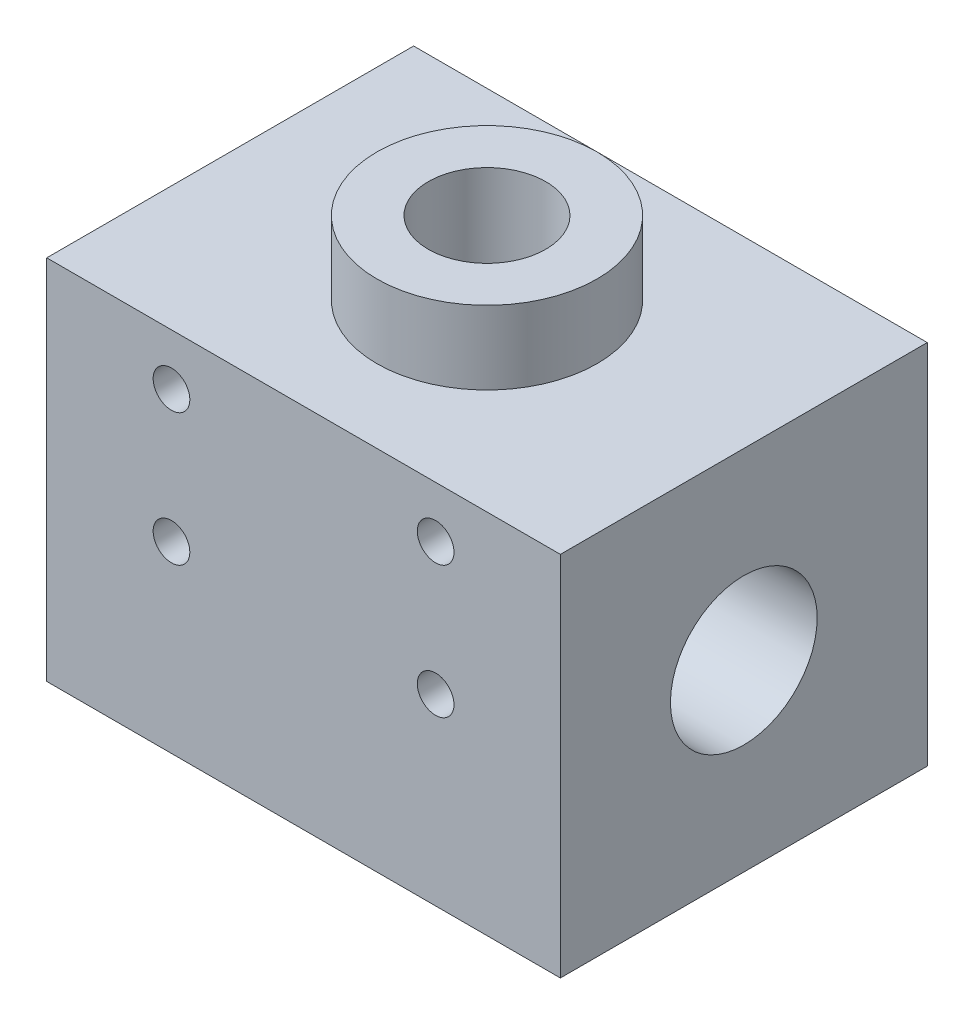
ISO-10303-21;
HEADER;
FILE_DESCRIPTION(('STEP AP214'),'2;1');
FILE_NAME('part.step','',(''),(''),'','','');
FILE_SCHEMA(('AUTOMOTIVE_DESIGN { 1 0 10303 214 1 1 1 1 }'));
ENDSEC;
DATA;
#1=APPLICATION_CONTEXT('core data for automotive mechanical design processes');
#2=APPLICATION_PROTOCOL_DEFINITION('international standard','automotive_design',2000,#1);
#3=PRODUCT_CONTEXT('',#1,'mechanical');
#4=PRODUCT('Part','Part','',(#3));
#5=PRODUCT_RELATED_PRODUCT_CATEGORY('part','',(#4));
#6=PRODUCT_DEFINITION_FORMATION('','',#4);
#7=PRODUCT_DEFINITION_CONTEXT('part definition',#1,'design');
#8=PRODUCT_DEFINITION('design','',#6,#7);
#9=PRODUCT_DEFINITION_SHAPE('','',#8);
#10=(LENGTH_UNIT() NAMED_UNIT(*) SI_UNIT(.MILLI.,.METRE.));
#11=(NAMED_UNIT(*) PLANE_ANGLE_UNIT() SI_UNIT($,.RADIAN.));
#12=(NAMED_UNIT(*) SI_UNIT($,.STERADIAN.) SOLID_ANGLE_UNIT());
#13=UNCERTAINTY_MEASURE_WITH_UNIT(LENGTH_MEASURE(1.E-05),#10,'distance_accuracy_value','');
#14=(GEOMETRIC_REPRESENTATION_CONTEXT(3) GLOBAL_UNCERTAINTY_ASSIGNED_CONTEXT((#13)) GLOBAL_UNIT_ASSIGNED_CONTEXT((#10,
#11,#12)) REPRESENTATION_CONTEXT('',''));
#15=CARTESIAN_POINT('',(0.,0.,0.));
#16=DIRECTION('',(0.,0.,1.));
#17=DIRECTION('',(1.,0.,0.));
#18=AXIS2_PLACEMENT_3D('',#15,#16,#17);
#19=CARTESIAN_POINT('',(-35.,50.,25.));
#20=DIRECTION('',(1.,0.,0.));
#21=DIRECTION('',(0.,0.,-1.));
#22=AXIS2_PLACEMENT_3D('',#19,#20,#21);
#23=PLANE('',#22);
#24=CARTESIAN_POINT('',(-35.,25.,0.));
#25=DIRECTION('',(1.,0.,0.));
#26=DIRECTION('',(0.,0.,-1.));
#27=AXIS2_PLACEMENT_3D('',#24,#25,#26);
#28=CIRCLE('',#27,10.);
#29=CARTESIAN_POINT('',(-35.,25.,-10.));
#30=VERTEX_POINT('',#29);
#31=EDGE_CURVE('E149',#30,#30,#28,.T.);
#32=ORIENTED_EDGE('',*,*,#31,.T.);
#33=EDGE_LOOP('',(#32));
#34=FACE_BOUND('',#33,.T.);
#35=DIRECTION('',(0.,0.,1.));
#36=VECTOR('',#35,1.);
#37=CARTESIAN_POINT('',(-35.,0.,25.));
#38=LINE('',#37,#36);
#39=CARTESIAN_POINT('',(-35.,0.,-25.));
#40=VERTEX_POINT('',#39);
#41=CARTESIAN_POINT('',(-35.,0.,25.));
#42=VERTEX_POINT('',#41);
#43=EDGE_CURVE('E130',#40,#42,#38,.T.);
#44=ORIENTED_EDGE('',*,*,#43,.T.);
#45=DIRECTION('',(0.,-1.,0.));
#46=VECTOR('',#45,1.);
#47=CARTESIAN_POINT('',(-35.,50.,25.));
#48=LINE('',#47,#46);
#49=CARTESIAN_POINT('',(-35.,50.,25.));
#50=VERTEX_POINT('',#49);
#51=EDGE_CURVE('E66',#50,#42,#48,.T.);
#52=ORIENTED_EDGE('',*,*,#51,.F.);
#53=DIRECTION('',(0.,0.,1.));
#54=VECTOR('',#53,1.);
#55=CARTESIAN_POINT('',(-35.,50.,25.));
#56=LINE('',#55,#54);
#57=CARTESIAN_POINT('',(-35.,50.,-25.));
#58=VERTEX_POINT('',#57);
#59=EDGE_CURVE('E111',#58,#50,#56,.T.);
#60=ORIENTED_EDGE('',*,*,#59,.F.);
#61=DIRECTION('',(0.,-1.,0.));
#62=VECTOR('',#61,1.);
#63=CARTESIAN_POINT('',(-35.,50.,-25.));
#64=LINE('',#63,#62);
#65=EDGE_CURVE('E126',#58,#40,#64,.T.);
#66=ORIENTED_EDGE('',*,*,#65,.T.);
#67=EDGE_LOOP('',(#44,#52,#60,#66));
#68=FACE_BOUND('',#67,.T.);
#69=ADVANCED_FACE('F51',(#34,#68),#23,.F.);
#70=CARTESIAN_POINT('',(35.,50.,25.));
#71=DIRECTION('',(0.,0.,-1.));
#72=DIRECTION('',(-1.,0.,0.));
#73=AXIS2_PLACEMENT_3D('',#70,#71,#72);
#74=PLANE('',#73);
#75=CARTESIAN_POINT('',(18.,25.,25.));
#76=DIRECTION('',(0.,0.,1.));
#77=DIRECTION('',(1.,0.,0.));
#78=AXIS2_PLACEMENT_3D('',#75,#76,#77);
#79=CIRCLE('',#78,2.5);
#80=CARTESIAN_POINT('',(20.5,25.,25.));
#81=VERTEX_POINT('',#80);
#82=EDGE_CURVE('E179',#81,#81,#79,.T.);
#83=ORIENTED_EDGE('',*,*,#82,.F.);
#84=EDGE_LOOP('',(#83));
#85=FACE_BOUND('',#84,.T.);
#86=CARTESIAN_POINT('',(-18.,43.,25.));
#87=DIRECTION('',(0.,0.,1.));
#88=DIRECTION('',(1.,0.,0.));
#89=AXIS2_PLACEMENT_3D('',#86,#87,#88);
#90=CIRCLE('',#89,2.5);
#91=CARTESIAN_POINT('',(-15.5,43.,25.));
#92=VERTEX_POINT('',#91);
#93=EDGE_CURVE('E196',#92,#92,#90,.T.);
#94=ORIENTED_EDGE('',*,*,#93,.F.);
#95=EDGE_LOOP('',(#94));
#96=FACE_BOUND('',#95,.T.);
#97=CARTESIAN_POINT('',(18.,43.,25.));
#98=DIRECTION('',(0.,0.,1.));
#99=DIRECTION('',(1.,0.,0.));
#100=AXIS2_PLACEMENT_3D('',#97,#98,#99);
#101=CIRCLE('',#100,2.5);
#102=CARTESIAN_POINT('',(20.5,43.,25.));
#103=VERTEX_POINT('',#102);
#104=EDGE_CURVE('E185',#103,#103,#101,.T.);
#105=ORIENTED_EDGE('',*,*,#104,.F.);
#106=EDGE_LOOP('',(#105));
#107=FACE_BOUND('',#106,.T.);
#108=CARTESIAN_POINT('',(-18.,25.,25.));
#109=DIRECTION('',(0.,0.,1.));
#110=DIRECTION('',(1.,0.,0.));
#111=AXIS2_PLACEMENT_3D('',#108,#109,#110);
#112=CIRCLE('',#111,2.5);
#113=CARTESIAN_POINT('',(-15.5,25.,25.));
#114=VERTEX_POINT('',#113);
#115=EDGE_CURVE('E171',#114,#114,#112,.T.);
#116=ORIENTED_EDGE('',*,*,#115,.F.);
#117=EDGE_LOOP('',(#116));
#118=FACE_BOUND('',#117,.T.);
#119=DIRECTION('',(1.,0.,0.));
#120=VECTOR('',#119,1.);
#121=CARTESIAN_POINT('',(35.,0.,25.));
#122=LINE('',#121,#120);
#123=CARTESIAN_POINT('',(35.,0.,25.));
#124=VERTEX_POINT('',#123);
#125=EDGE_CURVE('E117',#42,#124,#122,.T.);
#126=ORIENTED_EDGE('',*,*,#125,.T.);
#127=DIRECTION('',(0.,-1.,0.));
#128=VECTOR('',#127,1.);
#129=CARTESIAN_POINT('',(35.,50.,25.));
#130=LINE('',#129,#128);
#131=CARTESIAN_POINT('',(35.,50.,25.));
#132=VERTEX_POINT('',#131);
#133=EDGE_CURVE('E115',#132,#124,#130,.T.);
#134=ORIENTED_EDGE('',*,*,#133,.F.);
#135=DIRECTION('',(1.,0.,0.));
#136=VECTOR('',#135,1.);
#137=CARTESIAN_POINT('',(35.,50.,25.));
#138=LINE('',#137,#136);
#139=EDGE_CURVE('E106',#50,#132,#138,.T.);
#140=ORIENTED_EDGE('',*,*,#139,.F.);
#141=ORIENTED_EDGE('',*,*,#51,.T.);
#142=EDGE_LOOP('',(#126,#134,#140,#141));
#143=FACE_BOUND('',#142,.T.);
#144=ADVANCED_FACE('F116',(#85,#96,#107,#118,#143),#74,.F.);
#145=CARTESIAN_POINT('',(35.,50.,-25.));
#146=DIRECTION('',(-1.,0.,0.));
#147=DIRECTION('',(0.,0.,1.));
#148=AXIS2_PLACEMENT_3D('',#145,#146,#147);
#149=PLANE('',#148);
#150=CARTESIAN_POINT('',(35.,25.,0.));
#151=DIRECTION('',(-1.,0.,0.));
#152=DIRECTION('',(0.,0.,1.));
#153=AXIS2_PLACEMENT_3D('',#150,#151,#152);
#154=CIRCLE('',#153,10.);
#155=CARTESIAN_POINT('',(35.,25.,10.));
#156=VERTEX_POINT('',#155);
#157=EDGE_CURVE('E146',#156,#156,#154,.T.);
#158=ORIENTED_EDGE('',*,*,#157,.T.);
#159=EDGE_LOOP('',(#158));
#160=FACE_BOUND('',#159,.T.);
#161=DIRECTION('',(0.,0.,-1.));
#162=VECTOR('',#161,1.);
#163=CARTESIAN_POINT('',(35.,0.,-25.));
#164=LINE('',#163,#162);
#165=CARTESIAN_POINT('',(35.,0.,-25.));
#166=VERTEX_POINT('',#165);
#167=EDGE_CURVE('E92',#124,#166,#164,.T.);
#168=ORIENTED_EDGE('',*,*,#167,.T.);
#169=DIRECTION('',(0.,-1.,0.));
#170=VECTOR('',#169,1.);
#171=CARTESIAN_POINT('',(35.,50.,-25.));
#172=LINE('',#171,#170);
#173=CARTESIAN_POINT('',(35.,50.,-25.));
#174=VERTEX_POINT('',#173);
#175=EDGE_CURVE('E119',#174,#166,#172,.T.);
#176=ORIENTED_EDGE('',*,*,#175,.F.);
#177=DIRECTION('',(0.,0.,-1.));
#178=VECTOR('',#177,1.);
#179=CARTESIAN_POINT('',(35.,50.,-25.));
#180=LINE('',#179,#178);
#181=EDGE_CURVE('E109',#132,#174,#180,.T.);
#182=ORIENTED_EDGE('',*,*,#181,.F.);
#183=ORIENTED_EDGE('',*,*,#133,.T.);
#184=EDGE_LOOP('',(#168,#176,#182,#183));
#185=FACE_BOUND('',#184,.T.);
#186=ADVANCED_FACE('F121',(#160,#185),#149,.F.);
#187=CARTESIAN_POINT('',(-35.,50.,-25.));
#188=DIRECTION('',(0.,0.,1.));
#189=DIRECTION('',(1.,0.,0.));
#190=AXIS2_PLACEMENT_3D('',#187,#188,#189);
#191=PLANE('',#190);
#192=DIRECTION('',(-1.,0.,0.));
#193=VECTOR('',#192,1.);
#194=CARTESIAN_POINT('',(-35.,0.,-25.));
#195=LINE('',#194,#193);
#196=EDGE_CURVE('E98',#166,#40,#195,.T.);
#197=ORIENTED_EDGE('',*,*,#196,.T.);
#198=ORIENTED_EDGE('',*,*,#65,.F.);
#199=DIRECTION('',(-1.,0.,0.));
#200=VECTOR('',#199,1.);
#201=CARTESIAN_POINT('',(-35.,50.,-25.));
#202=LINE('',#201,#200);
#203=EDGE_CURVE('E75',#174,#58,#202,.T.);
#204=ORIENTED_EDGE('',*,*,#203,.F.);
#205=ORIENTED_EDGE('',*,*,#175,.T.);
#206=EDGE_LOOP('',(#197,#198,#204,#205));
#207=FACE_BOUND('',#206,.T.);
#208=ADVANCED_FACE('F252',(#207),#191,.F.);
#209=CARTESIAN_POINT('',(0.,50.,0.));
#210=DIRECTION('',(0.,-1.,0.));
#211=DIRECTION('',(0.,0.,-1.));
#212=AXIS2_PLACEMENT_3D('',#209,#210,#211);
#213=PLANE('',#212);
#214=CARTESIAN_POINT('',(0.,50.,0.));
#215=DIRECTION('',(0.,1.,0.));
#216=DIRECTION('',(0.,0.,1.));
#217=AXIS2_PLACEMENT_3D('',#214,#215,#216);
#218=CIRCLE('',#217,15.);
#219=CARTESIAN_POINT('',(0.,50.,15.));
#220=VERTEX_POINT('',#219);
#221=EDGE_CURVE('E11',#220,#220,#218,.T.);
#222=ORIENTED_EDGE('',*,*,#221,.F.);
#223=EDGE_LOOP('',(#222));
#224=FACE_BOUND('',#223,.T.);
#225=ORIENTED_EDGE('',*,*,#59,.T.);
#226=ORIENTED_EDGE('',*,*,#139,.T.);
#227=ORIENTED_EDGE('',*,*,#181,.T.);
#228=ORIENTED_EDGE('',*,*,#203,.T.);
#229=EDGE_LOOP('',(#225,#226,#227,#228));
#230=FACE_BOUND('',#229,.T.);
#231=ADVANCED_FACE('F107',(#224,#230),#213,.F.);
#232=CARTESIAN_POINT('',(0.,0.,0.));
#233=DIRECTION('',(0.,-1.,0.));
#234=DIRECTION('',(0.,0.,-1.));
#235=AXIS2_PLACEMENT_3D('',#232,#233,#234);
#236=PLANE('',#235);
#237=ORIENTED_EDGE('',*,*,#43,.F.);
#238=ORIENTED_EDGE('',*,*,#196,.F.);
#239=ORIENTED_EDGE('',*,*,#167,.F.);
#240=ORIENTED_EDGE('',*,*,#125,.F.);
#241=EDGE_LOOP('',(#237,#238,#239,#240));
#242=FACE_BOUND('',#241,.T.);
#243=ADVANCED_FACE('F242',(#242),#236,.T.);
#244=CARTESIAN_POINT('',(0.,60.,0.));
#245=DIRECTION('',(0.,-1.,0.));
#246=DIRECTION('',(0.,0.,-1.));
#247=AXIS2_PLACEMENT_3D('',#244,#245,#246);
#248=CYLINDRICAL_SURFACE('',#247,15.);
#249=CARTESIAN_POINT('',(0.,60.,0.));
#250=DIRECTION('',(0.,1.,0.));
#251=DIRECTION('',(0.,0.,1.));
#252=AXIS2_PLACEMENT_3D('',#249,#250,#251);
#253=CIRCLE('',#252,15.);
#254=CARTESIAN_POINT('',(0.,60.,15.));
#255=VERTEX_POINT('',#254);
#256=EDGE_CURVE('E134',#255,#255,#253,.T.);
#257=ORIENTED_EDGE('',*,*,#256,.F.);
#258=EDGE_LOOP('',(#257));
#259=FACE_BOUND('',#258,.T.);
#260=ORIENTED_EDGE('',*,*,#221,.T.);
#261=EDGE_LOOP('',(#260));
#262=FACE_BOUND('',#261,.T.);
#263=ADVANCED_FACE('F244',(#259,#262),#248,.T.);
#264=CARTESIAN_POINT('',(0.,60.,0.));
#265=DIRECTION('',(0.,1.,0.));
#266=DIRECTION('',(0.,0.,1.));
#267=AXIS2_PLACEMENT_3D('',#264,#265,#266);
#268=PLANE('',#267);
#269=CARTESIAN_POINT('',(0.,60.,0.));
#270=DIRECTION('',(0.,1.,0.));
#271=DIRECTION('',(0.,0.,1.));
#272=AXIS2_PLACEMENT_3D('',#269,#270,#271);
#273=CIRCLE('',#272,8.);
#274=CARTESIAN_POINT('',(0.,60.,8.));
#275=VERTEX_POINT('',#274);
#276=EDGE_CURVE('E157',#275,#275,#273,.T.);
#277=ORIENTED_EDGE('',*,*,#276,.F.);
#278=EDGE_LOOP('',(#277));
#279=FACE_BOUND('',#278,.T.);
#280=ORIENTED_EDGE('',*,*,#256,.T.);
#281=EDGE_LOOP('',(#280));
#282=FACE_BOUND('',#281,.T.);
#283=ADVANCED_FACE('F249',(#279,#282),#268,.T.);
#284=CARTESIAN_POINT('',(-71.,25.,0.));
#285=DIRECTION('',(1.,0.,0.));
#286=DIRECTION('',(0.,0.,-1.));
#287=AXIS2_PLACEMENT_3D('',#284,#285,#286);
#288=CYLINDRICAL_SURFACE('',#287,10.);
#289=CARTESIAN_POINT('',(0.,31.,8.));
#290=CARTESIAN_POINT('',(0.15022459738487,31.0000035625211,7.99999850547057));
#291=CARTESIAN_POINT('',(0.300504131601658,31.0056701147003,7.99575712002106));
#292=CARTESIAN_POINT('',(0.599822762570285,31.028057010504,7.97889190649412));
#293=CARTESIAN_POINT('',(0.748860943249638,31.0447848916728,7.96626236243051));
#294=CARTESIAN_POINT('',(1.04487223919572,31.0885361116284,7.93287350748029));
#295=CARTESIAN_POINT('',(1.1918391486777,31.1155854892796,7.9120936313708));
#296=CARTESIAN_POINT('',(1.48254201812359,31.1788162695663,7.86281319571144));
#297=CARTESIAN_POINT('',(1.62627575657817,31.2150037541004,7.83430749328154));
#298=CARTESIAN_POINT('',(1.95928819427813,31.309133847231,7.75884142962143));
#299=CARTESIAN_POINT('',(2.14699454247974,31.3702638264302,7.70891139176625));
#300=CARTESIAN_POINT('',(2.51467773958042,31.5033987631141,7.59693100706947));
#301=CARTESIAN_POINT('',(2.6946543370537,31.5754040739974,7.53488026634113));
#302=CARTESIAN_POINT('',(3.04722385598971,31.7275717216712,7.39933665411533));
#303=CARTESIAN_POINT('',(3.21979742729863,31.8077537806487,7.32581587966415));
#304=CARTESIAN_POINT('',(3.55716094079825,31.9736527052382,7.16807370451545));
#305=CARTESIAN_POINT('',(3.72195108039004,32.059369430351,7.08385257539726));
#306=CARTESIAN_POINT('',(4.10215769308783,32.2659318278601,6.87278634555154));
#307=CARTESIAN_POINT('',(4.31433145410594,32.3882714394334,6.74154128211599));
#308=CARTESIAN_POINT('',(4.72473552644333,32.6352012594411,6.46055204176311));
#309=CARTESIAN_POINT('',(4.92296079286415,32.7597922618913,6.31080122510044));
#310=CARTESIAN_POINT('',(5.30497690322165,33.0076016087498,5.99323431368263));
#311=CARTESIAN_POINT('',(5.48877921215059,33.1308209752286,5.82543282445919));
#312=CARTESIAN_POINT('',(5.84132029595654,33.3728499756174,5.47186088496404));
#313=CARTESIAN_POINT('',(6.01006407939447,33.491661068008,5.2860964524364));
#314=CARTESIAN_POINT('',(6.29955870869471,33.699217719499,4.93523769395914));
#315=CARTESIAN_POINT('',(6.42320823329404,33.7892687769061,4.773300959646));
#316=CARTESIAN_POINT('',(6.65914999828478,33.9631422396163,4.43820831441267));
#317=CARTESIAN_POINT('',(6.7714444358219,34.0469658490597,4.2650545845973));
#318=CARTESIAN_POINT('',(6.98353078174688,34.2067828965185,3.90811229430166));
#319=CARTESIAN_POINT('',(7.0833373855595,34.2827855190386,3.72433661319781));
#320=CARTESIAN_POINT('',(7.26942072543666,34.4255459242732,3.34661343718593));
#321=CARTESIAN_POINT('',(7.35569970596085,34.4923052403917,3.15266763681224));
#322=CARTESIAN_POINT('',(7.5007245521569,34.6051625512352,2.78768994179331));
#323=CARTESIAN_POINT('',(7.56166661486986,34.6528559822697,2.61802183428175));
#324=CARTESIAN_POINT('',(7.6724316798399,34.7398681908194,2.27301580125696));
#325=CARTESIAN_POINT('',(7.72225680044521,34.7791885637667,2.09767896323078));
#326=CARTESIAN_POINT('',(7.81010153789945,34.8487037212126,1.7423528687864));
#327=CARTESIAN_POINT('',(7.84812512938336,34.8789015779902,1.56236520089122));
#328=CARTESIAN_POINT('',(7.91181365838404,34.929573138509,1.19885362524063));
#329=CARTESIAN_POINT('',(7.93747844833067,34.9500467261376,1.01532967528751));
#330=CARTESIAN_POINT('',(7.97609546968864,34.9808798664654,0.645442904479312));
#331=CARTESIAN_POINT('',(7.98900275330996,34.9912036582981,0.459072378956125));
#332=CARTESIAN_POINT('',(8.00172379256273,35.0013783526599,0.0855968189260277));
#333=CARTESIAN_POINT('',(8.00153752300758,35.0012292350435,-0.101508216993086));
#334=CARTESIAN_POINT('',(7.98807470334787,34.9904615176309,-0.47494720437459));
#335=CARTESIAN_POINT('',(7.97479771000684,34.9798425633384,-0.661281129513557));
#336=CARTESIAN_POINT('',(7.93538178672806,34.9483739052353,-1.0317009677617));
#337=CARTESIAN_POINT('',(7.90924315344384,34.9275244373914,-1.21578693261968));
#338=CARTESIAN_POINT('',(7.84631181969092,34.8774625909737,-1.57035549635709));
#339=CARTESIAN_POINT('',(7.81018184923011,34.8487714202642,-1.74103055156827));
#340=CARTESIAN_POINT('',(7.72729892134606,34.7831747057938,-2.07822216463014));
#341=CARTESIAN_POINT('',(7.68054235729817,34.7462663732471,-2.24473728927077));
#342=CARTESIAN_POINT('',(7.5769987362147,34.6648788845584,-2.57267278104258));
#343=CARTESIAN_POINT('',(7.52021384398611,34.6204013624463,-2.73409423889292));
#344=CARTESIAN_POINT('',(7.39722556705919,34.5245718312793,-3.05123215137682));
#345=CARTESIAN_POINT('',(7.3310187358091,34.4732173070197,-3.20694649201474));
#346=CARTESIAN_POINT('',(7.10566605995239,34.299500025845,-3.6939296299468));
#347=CARTESIAN_POINT('',(6.92972868922837,34.1654005550686,-4.01344906782813));
#348=CARTESIAN_POINT('',(6.54181378883856,33.8757318004014,-4.6189053975236));
#349=CARTESIAN_POINT('',(6.32981608395802,33.7201505069779,-4.90482333755279));
#350=CARTESIAN_POINT('',(5.96495562488035,33.4599931051072,-5.33520078810716));
#351=CARTESIAN_POINT('',(5.8219768002602,33.3596542542938,-5.49079696244521));
#352=CARTESIAN_POINT('',(5.52533478553696,33.1558378737339,-5.78920834677225));
#353=CARTESIAN_POINT('',(5.37167299407893,33.0523607558548,-5.93202522428543));
#354=CARTESIAN_POINT('',(5.05394986566676,32.8439788220106,-6.20495908338477));
#355=CARTESIAN_POINT('',(4.88987513865482,32.7390723098274,-6.33505914332126));
#356=CARTESIAN_POINT('',(4.55175259790764,32.5299923086413,-6.58220317054509));
#357=CARTESIAN_POINT('',(4.37770598226786,32.4258187332597,-6.69924870134031));
#358=CARTESIAN_POINT('',(4.03689456896995,32.2304188739501,-6.90938493162869));
#359=CARTESIAN_POINT('',(3.87104374843252,32.1389121545167,-7.0036970996744));
#360=CARTESIAN_POINT('',(3.5310600355781,31.9604190506679,-7.18111377588424));
#361=CARTESIAN_POINT('',(3.35692619895514,31.8734331840298,-7.26421700200963));
#362=CARTESIAN_POINT('',(3.00052371047962,31.7065951360486,-7.41852221314823));
#363=CARTESIAN_POINT('',(2.81826953143255,31.6267309688985,-7.48974437690968));
#364=CARTESIAN_POINT('',(2.44549083299329,31.4769774082942,-7.61961784585522));
#365=CARTESIAN_POINT('',(2.2549701442279,31.4070834577709,-7.67827490034183));
#366=CARTESIAN_POINT('',(1.78888186265353,31.2557630735838,-7.80246813810599));
#367=CARTESIAN_POINT('',(1.50937317616992,31.1806373561221,-7.86161401964439));
#368=CARTESIAN_POINT('',(1.08163768728951,31.0951092926614,-7.92785703981829));
#369=CARTESIAN_POINT('',(0.937742220797687,31.0711333875207,-7.94618750700997));
#370=CARTESIAN_POINT('',(0.647823036583923,31.0331640805168,-7.97505562335784));
#371=CARTESIAN_POINT('',(0.501799365724547,31.0191704591838,-7.98559344384275));
#372=CARTESIAN_POINT('',(0.207894900109437,31.0017972707818,-7.99865927125614));
#373=CARTESIAN_POINT('',(0.0600082318572445,30.9984807776521,-8.00113968070391));
#374=CARTESIAN_POINT('',(-0.235510806429662,31.0028025366031,-7.99789775429116));
#375=CARTESIAN_POINT('',(-0.383143180489207,31.0104406136757,-7.99217554947408));
#376=CARTESIAN_POINT('',(-0.677069628848396,31.0363038081906,-7.97265920777897));
#377=CARTESIAN_POINT('',(-0.823362274752607,31.0545391314788,-7.95885728951073));
#378=CARTESIAN_POINT('',(-1.11350747652078,31.1007668881754,-7.92347678294739));
#379=CARTESIAN_POINT('',(-1.25735845471891,31.1287653958187,-7.90189335304496));
#380=CARTESIAN_POINT('',(-1.57788279667276,31.2015776331507,-7.84493960984963));
#381=CARTESIAN_POINT('',(-1.75362146191374,31.2488554893154,-7.80746054479984));
#382=CARTESIAN_POINT('',(-2.09907723166816,31.3544491243248,-7.72176071100922));
#383=CARTESIAN_POINT('',(-2.26879125970798,31.4127704488948,-7.6735345432082));
#384=CARTESIAN_POINT('',(-2.60215897488045,31.5381428785033,-7.56699838694255));
#385=CARTESIAN_POINT('',(-2.76579742483156,31.6052142481051,-7.50866488429104));
#386=CARTESIAN_POINT('',(-3.08652158747696,31.7458021111638,-7.38261988831835));
#387=CARTESIAN_POINT('',(-3.24360700483516,31.8193188946443,-7.31490797291798));
#388=CARTESIAN_POINT('',(-3.6217926991147,32.0056551577577,-7.13750913219513));
#389=CARTESIAN_POINT('',(-3.8392749675256,32.1210590295198,-7.02279764848336));
#390=CARTESIAN_POINT('',(-4.26085040578843,32.3569253304349,-6.77531704020675));
#391=CARTESIAN_POINT('',(-4.46493802663264,32.4773898225818,-6.64254050094866));
#392=CARTESIAN_POINT('',(-4.85990802882122,32.7197399713579,-6.35927652866584));
#393=CARTESIAN_POINT('',(-5.05077718980288,32.8416269122779,-6.2087717597543));
#394=CARTESIAN_POINT('',(-5.4186955973759,33.0835060679972,-5.8904075332111));
#395=CARTESIAN_POINT('',(-5.59574700048332,33.2034985761165,-5.72255079321845));
#396=CARTESIAN_POINT('',(-5.93770141714218,33.4404321398181,-5.36706505504179));
#397=CARTESIAN_POINT('',(-6.10239378536135,33.5573047517753,-5.17918701450815));
#398=CARTESIAN_POINT('',(-6.41548625129911,33.7833215523416,-4.78588595979406));
#399=CARTESIAN_POINT('',(-6.56388379927631,33.892464530506,-4.58046020874131));
#400=CARTESIAN_POINT('',(-6.84220786278276,34.0998475373332,-4.15319348553334));
#401=CARTESIAN_POINT('',(-6.97218401160413,34.1981167004931,-3.93139916922695));
#402=CARTESIAN_POINT('',(-7.21197368756802,34.3811817155991,-3.47195618236025));
#403=CARTESIAN_POINT('',(-7.32179863061082,34.4659851923301,-3.23431659302677));
#404=CARTESIAN_POINT('',(-7.4871649459668,34.5945759517856,-2.82388510571559));
#405=CARTESIAN_POINT('',(-7.54879037532832,34.6427709365331,-2.65489537054561));
#406=CARTESIAN_POINT('',(-7.66100481932081,34.7308675927928,-2.31120271030773));
#407=CARTESIAN_POINT('',(-7.71159670784888,34.7707714237665,-2.13650128662404));
#408=CARTESIAN_POINT('',(-7.80104601765855,34.8415227900793,-1.78241638140578));
#409=CARTESIAN_POINT('',(-7.83990965231649,34.8723751204665,-1.6030354339024));
#410=CARTESIAN_POINT('',(-7.90535819768663,34.9244291587178,-1.24064885437532));
#411=CARTESIAN_POINT('',(-7.93194267189601,34.9456305235066,-1.05764309373695));
#412=CARTESIAN_POINT('',(-7.97247259551144,34.9779842336916,-0.688660273637502));
#413=CARTESIAN_POINT('',(-7.98637105229934,34.9890992153786,-0.502674742837961));
#414=CARTESIAN_POINT('',(-8.00112113298116,35.0008959415595,-0.12985480240814));
#415=CARTESIAN_POINT('',(-8.00197280867149,35.0015777274738,0.056979603849114));
#416=CARTESIAN_POINT('',(-7.9906144106453,34.9924925426944,0.430005030742398));
#417=CARTESIAN_POINT('',(-7.97840350047307,34.9827249028772,0.616196009410917));
#418=CARTESIAN_POINT('',(-7.94112912725094,34.9529596623736,0.986452085103599));
#419=CARTESIAN_POINT('',(-7.91606594558708,34.9329622856556,1.17051722858032));
#420=CARTESIAN_POINT('',(-7.85518763356242,34.8845158147891,1.52534233748454));
#421=CARTESIAN_POINT('',(-7.82002374677127,34.8565794972966,1.69628523757394));
#422=CARTESIAN_POINT('',(-7.73903296117567,34.7924470852477,2.0340973654798));
#423=CARTESIAN_POINT('',(-7.6932024303507,34.7562481773385,2.20096518428782));
#424=CARTESIAN_POINT('',(-7.59146355168149,34.6762250101504,2.52967809365013));
#425=CARTESIAN_POINT('',(-7.5355573126175,34.6324023465403,2.69152422691808));
#426=CARTESIAN_POINT('',(-7.41427676635361,34.5378229780351,3.00956874161385));
#427=CARTESIAN_POINT('',(-7.34889898806248,34.4870637314376,3.16576502616878));
#428=CARTESIAN_POINT('',(-7.12656961704094,34.3154984645699,3.65335383729774));
#429=CARTESIAN_POINT('',(-6.95285903456207,34.1829254602791,3.97317038012611));
#430=CARTESIAN_POINT('',(-6.56939623029826,33.8961062444394,4.57952585479548));
#431=CARTESIAN_POINT('',(-6.35962487260164,33.7418485337057,4.86604698218988));
#432=CARTESIAN_POINT('',(-5.99851162441798,33.4837007576163,5.29741387615485));
#433=CARTESIAN_POINT('',(-5.8570593468008,33.3841433189764,5.45332719334461));
#434=CARTESIAN_POINT('',(-5.56351559635102,33.1817714471187,5.75249575586661));
#435=CARTESIAN_POINT('',(-5.4114254931595,33.0789574341205,5.8957526253861));
#436=CARTESIAN_POINT('',(-5.09690553955502,32.8717485393969,6.16969303597325));
#437=CARTESIAN_POINT('',(-4.9344622511486,32.7673517428858,6.30035965956407));
#438=CARTESIAN_POINT('',(-4.59967861657433,32.5590908349388,6.54877096921903));
#439=CARTESIAN_POINT('',(-4.42733936815391,32.4552266658062,6.66651708433833));
#440=CARTESIAN_POINT('',(-4.08711386391033,32.2585687919264,6.87986147468855));
#441=CARTESIAN_POINT('',(-3.91999282439702,32.165558655438,6.97648055700592));
#442=CARTESIAN_POINT('',(-3.57726205087539,31.9839583212164,7.15826985952809));
#443=CARTESIAN_POINT('',(-3.40165118591892,31.8953687155636,7.24343854865576));
#444=CARTESIAN_POINT('',(-3.04206127679533,31.7252564635126,7.40164833259944));
#445=CARTESIAN_POINT('',(-2.85809414393556,31.6437242112386,7.47470603996769));
#446=CARTESIAN_POINT('',(-2.48156626092665,31.4906571295285,7.60800017607482));
#447=CARTESIAN_POINT('',(-2.2890098908808,31.4191172796288,7.66824305135967));
#448=CARTESIAN_POINT('',(-1.95386340901158,31.3087633834062,7.75905938511667));
#449=CARTESIAN_POINT('',(-1.81334518597964,31.2665291648308,7.79313760396692));
#450=CARTESIAN_POINT('',(-1.52859014361041,31.1901369919028,7.85395376355246));
#451=CARTESIAN_POINT('',(-1.3843546485303,31.1559762043637,7.88069427981941));
#452=CARTESIAN_POINT('',(-1.09319663670031,31.0971156563687,7.92632124595051));
#453=CARTESIAN_POINT('',(-0.946283679137898,31.0723873004537,7.94523144943217));
#454=CARTESIAN_POINT('',(-0.650319581770236,31.0333610017496,7.97490856466575));
#455=CARTESIAN_POINT('',(-0.501270013813224,31.0190557558922,7.98568117830565));
#456=CARTESIAN_POINT('',(-0.293236604790748,31.0068760517793,7.99483909530783));
#457=CARTESIAN_POINT('',(-0.234642539151651,31.0043003575955,7.99677323072384));
#458=CARTESIAN_POINT('',(-0.117368450698288,31.0008615243307,7.99935405881775));
#459=CARTESIAN_POINT('',(-0.0586884176874277,30.9999986082258,8.00000058386955));
#460=CARTESIAN_POINT('',(0.,31.,8.));
#461=B_SPLINE_CURVE_WITH_KNOTS('',3,(#289,#290,#291,#292,#293,#294,#295,#296,#297,#298,#299,
#300,#301,#302,#303,#304,#305,#306,#307,#308,#309,#310,#311,#312,#313,#314,#315,#316,#317,#318,
#319,#320,#321,#322,#323,#324,#325,#326,#327,#328,#329,#330,#331,#332,#333,#334,#335,#336,#337,
#338,#339,#340,#341,#342,#343,#344,#345,#346,#347,#348,#349,#350,#351,#352,#353,#354,#355,#356,
#357,#358,#359,#360,#361,#362,#363,#364,#365,#366,#367,#368,#369,#370,#371,#372,#373,#374,#375,
#376,#377,#378,#379,#380,#381,#382,#383,#384,#385,#386,#387,#388,#389,#390,#391,#392,#393,#394,
#395,#396,#397,#398,#399,#400,#401,#402,#403,#404,#405,#406,#407,#408,#409,#410,#411,#412,#413,
#414,#415,#416,#417,#418,#419,#420,#421,#422,#423,#424,#425,#426,#427,#428,#429,#430,#431,#432,
#433,#434,#435,#436,#437,#438,#439,#440,#441,#442,#443,#444,#445,#446,#447,#448,#449,#450,#451,
#452,#453,#454,#455,#456,#457,#458,#459,#460),.UNSPECIFIED.,.T.,.F.,(4,2,2,2,2,2,2,2,2,2,2,2,2,
2,2,2,2,2,2,2,2,2,2,2,2,2,2,2,2,2,2,2,2,2,2,2,2,2,2,2,2,2,2,2,2,2,2,2,2,2,2,2,2,2,2,2,2,2,2,2,2,
2,2,2,2,2,2,2,2,2,2,2,2,2,2,2,2,2,2,2,2,2,2,2,2,4),(0.,0.450606299614462,0.901519973676548,
1.35357880611544,1.8059393045256,2.41584789433292,3.02577630765049,3.63721230982387,
4.24863279660231,5.08116194685192,5.91399067523193,6.74615052600714,7.57803255543161,
8.24571319317796,8.91326439024934,9.58002248705789,10.2466698401778,10.8055557245148,
11.3643350212721,11.9229259221237,12.4815234926587,13.0420821963222,13.6026419782702,
14.1632207407637,14.7237865741235,15.2536171560135,15.7836278295953,16.3135242297491,
16.8436149670074,18.0049267579594,19.1668904354683,19.8681109783519,20.5692398876651,
21.2712894046784,21.9732547485046,22.6075897572729,23.2419972576007,23.875316063926,
24.5083444664164,25.3907054643292,25.8313204999235,26.2719258478914,26.7151292918451,
27.1583256553425,27.6019495551256,28.045849952592,28.6024005613437,29.1592313992438,
29.7173755088329,30.2755447460869,31.0892572695395,31.9033047896381,32.7181550553137,
33.5328778931948,34.3592852448837,35.1858217254169,36.0100870934492,36.8338840537071,
37.3920107728034,37.9499919430164,38.5076769857722,39.0653818517365,39.6251443288452,
40.1849045836663,40.7447006845826,41.3044845299156,41.8341418130277,42.363979710385,
42.8937068446199,43.4236286045013,44.5810964856001,45.7391804922371,46.4372454590117,
47.135220713401,47.8341211250873,48.5329441577693,49.1753059573187,49.8177535643469,
50.459312504776,51.1005479394881,51.5520690389131,52.0034314512373,52.453414422329,
52.9030818038455,53.0790977765726,53.255136662246),.UNSPECIFIED.);
#462=CARTESIAN_POINT('',(0.,31.,8.));
#463=VERTEX_POINT('',#462);
#464=EDGE_CURVE('E54',#463,#463,#461,.T.);
#465=ORIENTED_EDGE('',*,*,#464,.T.);
#466=EDGE_LOOP('',(#465));
#467=FACE_BOUND('',#466,.T.);
#468=ORIENTED_EDGE('',*,*,#157,.F.);
#469=EDGE_LOOP('',(#468));
#470=FACE_BOUND('',#469,.T.);
#471=ORIENTED_EDGE('',*,*,#31,.F.);
#472=EDGE_LOOP('',(#471));
#473=FACE_BOUND('',#472,.T.);
#474=ADVANCED_FACE('F232',(#467,#470,#473),#288,.F.);
#475=CARTESIAN_POINT('',(0.,25.,0.));
#476=DIRECTION('',(0.,1.,0.));
#477=DIRECTION('',(0.,0.,1.));
#478=AXIS2_PLACEMENT_3D('',#475,#476,#477);
#479=CYLINDRICAL_SURFACE('',#478,8.);
#480=ORIENTED_EDGE('',*,*,#276,.T.);
#481=EDGE_LOOP('',(#480));
#482=FACE_BOUND('',#481,.T.);
#483=ORIENTED_EDGE('',*,*,#464,.F.);
#484=EDGE_LOOP('',(#483));
#485=FACE_BOUND('',#484,.T.);
#486=ADVANCED_FACE('F223',(#482,#485),#479,.F.);
#487=CARTESIAN_POINT('',(-18.,25.,15.));
#488=DIRECTION('',(0.,0.,1.));
#489=DIRECTION('',(1.,0.,0.));
#490=AXIS2_PLACEMENT_3D('',#487,#488,#489);
#491=CYLINDRICAL_SURFACE('',#490,2.5);
#492=CARTESIAN_POINT('',(-18.,25.,15.));
#493=DIRECTION('',(0.,0.,1.));
#494=DIRECTION('',(1.,0.,0.));
#495=AXIS2_PLACEMENT_3D('',#492,#493,#494);
#496=CIRCLE('',#495,2.5);
#497=CARTESIAN_POINT('',(-15.5,25.,15.));
#498=VERTEX_POINT('',#497);
#499=EDGE_CURVE('E163',#498,#498,#496,.T.);
#500=ORIENTED_EDGE('',*,*,#499,.F.);
#501=EDGE_LOOP('',(#500));
#502=FACE_BOUND('',#501,.T.);
#503=ORIENTED_EDGE('',*,*,#115,.T.);
#504=EDGE_LOOP('',(#503));
#505=FACE_BOUND('',#504,.T.);
#506=ADVANCED_FACE('F220',(#502,#505),#491,.F.);
#507=CARTESIAN_POINT('',(-18.,25.,15.));
#508=DIRECTION('',(0.,0.,1.));
#509=DIRECTION('',(1.,0.,0.));
#510=AXIS2_PLACEMENT_3D('',#507,#508,#509);
#511=PLANE('',#510);
#512=ORIENTED_EDGE('',*,*,#499,.T.);
#513=EDGE_LOOP('',(#512));
#514=FACE_BOUND('',#513,.T.);
#515=ADVANCED_FACE('F222',(#514),#511,.T.);
#516=CARTESIAN_POINT('',(18.,43.,15.));
#517=DIRECTION('',(0.,0.,1.));
#518=DIRECTION('',(1.,0.,0.));
#519=AXIS2_PLACEMENT_3D('',#516,#517,#518);
#520=CYLINDRICAL_SURFACE('',#519,2.5);
#521=CARTESIAN_POINT('',(18.,43.,15.));
#522=DIRECTION('',(0.,0.,1.));
#523=DIRECTION('',(1.,0.,0.));
#524=AXIS2_PLACEMENT_3D('',#521,#522,#523);
#525=CIRCLE('',#524,2.5);
#526=CARTESIAN_POINT('',(20.5,43.,15.));
#527=VERTEX_POINT('',#526);
#528=EDGE_CURVE('E183',#527,#527,#525,.T.);
#529=ORIENTED_EDGE('',*,*,#528,.F.);
#530=EDGE_LOOP('',(#529));
#531=FACE_BOUND('',#530,.T.);
#532=ORIENTED_EDGE('',*,*,#104,.T.);
#533=EDGE_LOOP('',(#532));
#534=FACE_BOUND('',#533,.T.);
#535=ADVANCED_FACE('F229',(#531,#534),#520,.F.);
#536=CARTESIAN_POINT('',(18.,43.,15.));
#537=DIRECTION('',(0.,0.,1.));
#538=DIRECTION('',(1.,0.,0.));
#539=AXIS2_PLACEMENT_3D('',#536,#537,#538);
#540=PLANE('',#539);
#541=ORIENTED_EDGE('',*,*,#528,.T.);
#542=EDGE_LOOP('',(#541));
#543=FACE_BOUND('',#542,.T.);
#544=ADVANCED_FACE('F207',(#543),#540,.T.);
#545=CARTESIAN_POINT('',(-18.,43.,15.));
#546=DIRECTION('',(0.,0.,1.));
#547=DIRECTION('',(1.,0.,0.));
#548=AXIS2_PLACEMENT_3D('',#545,#546,#547);
#549=CYLINDRICAL_SURFACE('',#548,2.5);
#550=CARTESIAN_POINT('',(-18.,43.,15.));
#551=DIRECTION('',(0.,0.,1.));
#552=DIRECTION('',(1.,0.,0.));
#553=AXIS2_PLACEMENT_3D('',#550,#551,#552);
#554=CIRCLE('',#553,2.5);
#555=CARTESIAN_POINT('',(-15.5,43.,15.));
#556=VERTEX_POINT('',#555);
#557=EDGE_CURVE('E190',#556,#556,#554,.T.);
#558=ORIENTED_EDGE('',*,*,#557,.F.);
#559=EDGE_LOOP('',(#558));
#560=FACE_BOUND('',#559,.T.);
#561=ORIENTED_EDGE('',*,*,#93,.T.);
#562=EDGE_LOOP('',(#561));
#563=FACE_BOUND('',#562,.T.);
#564=ADVANCED_FACE('F204',(#560,#563),#549,.F.);
#565=CARTESIAN_POINT('',(-18.,43.,15.));
#566=DIRECTION('',(0.,0.,1.));
#567=DIRECTION('',(1.,0.,0.));
#568=AXIS2_PLACEMENT_3D('',#565,#566,#567);
#569=PLANE('',#568);
#570=ORIENTED_EDGE('',*,*,#557,.T.);
#571=EDGE_LOOP('',(#570));
#572=FACE_BOUND('',#571,.T.);
#573=ADVANCED_FACE('F202',(#572),#569,.T.);
#574=CARTESIAN_POINT('',(18.,25.,15.));
#575=DIRECTION('',(0.,0.,1.));
#576=DIRECTION('',(1.,0.,0.));
#577=AXIS2_PLACEMENT_3D('',#574,#575,#576);
#578=CYLINDRICAL_SURFACE('',#577,2.5);
#579=CARTESIAN_POINT('',(18.,25.,15.));
#580=DIRECTION('',(0.,0.,1.));
#581=DIRECTION('',(1.,0.,0.));
#582=AXIS2_PLACEMENT_3D('',#579,#580,#581);
#583=CIRCLE('',#582,2.5);
#584=CARTESIAN_POINT('',(20.5,25.,15.));
#585=VERTEX_POINT('',#584);
#586=EDGE_CURVE('E181',#585,#585,#583,.T.);
#587=ORIENTED_EDGE('',*,*,#586,.F.);
#588=EDGE_LOOP('',(#587));
#589=FACE_BOUND('',#588,.T.);
#590=ORIENTED_EDGE('',*,*,#82,.T.);
#591=EDGE_LOOP('',(#590));
#592=FACE_BOUND('',#591,.T.);
#593=ADVANCED_FACE('F327',(#589,#592),#578,.F.);
#594=CARTESIAN_POINT('',(18.,25.,15.));
#595=DIRECTION('',(0.,0.,1.));
#596=DIRECTION('',(1.,0.,0.));
#597=AXIS2_PLACEMENT_3D('',#594,#595,#596);
#598=PLANE('',#597);
#599=ORIENTED_EDGE('',*,*,#586,.T.);
#600=EDGE_LOOP('',(#599));
#601=FACE_BOUND('',#600,.T.);
#602=ADVANCED_FACE('F334',(#601),#598,.T.);
#603=CLOSED_SHELL('',(#69,#144,#186,#208,#231,#243,#263,#283,#474,#486,#506,#515,#535,#544,#564,
#573,#593,#602));
#604=MANIFOLD_SOLID_BREP('B2',#603);
#605=ADVANCED_BREP_SHAPE_REPRESENTATION('',(#18,#604),#14);
#606=SHAPE_DEFINITION_REPRESENTATION(#9,#605);
ENDSEC;
END-ISO-10303-21;
